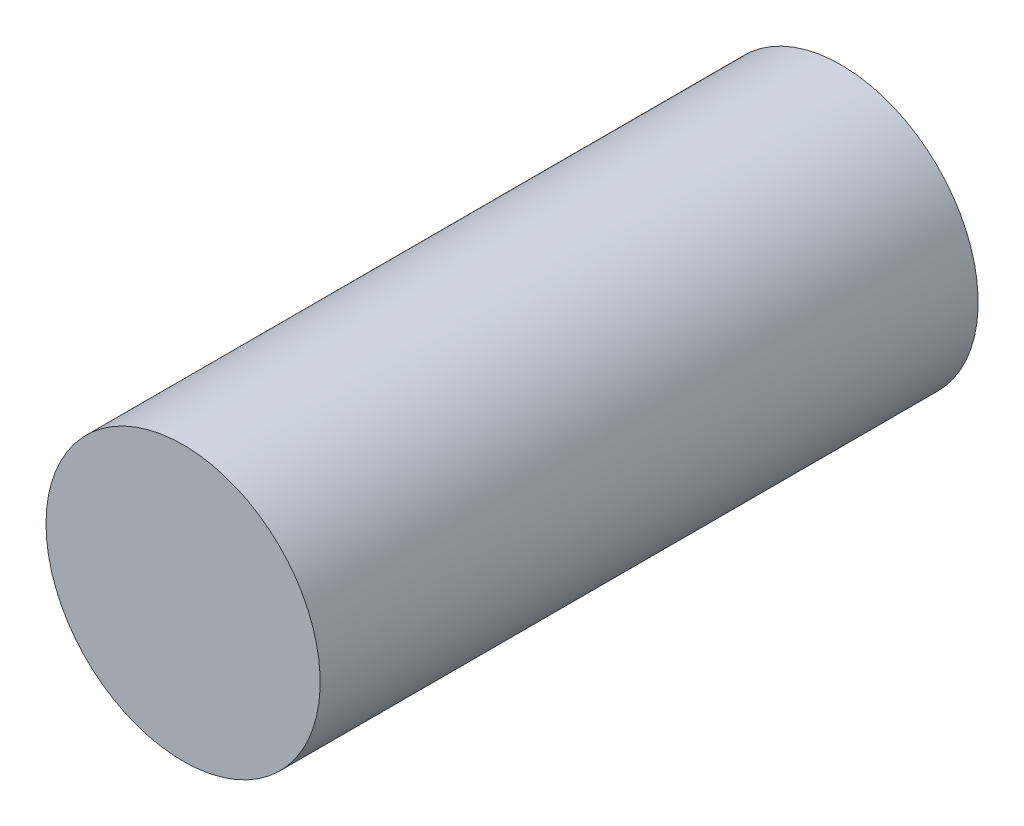
ISO-10303-21;
HEADER;
FILE_DESCRIPTION(('STEP AP214'),'2;1');
FILE_NAME('part.step','',(''),(''),'','','');
FILE_SCHEMA(('AUTOMOTIVE_DESIGN { 1 0 10303 214 1 1 1 1 }'));
ENDSEC;
DATA;
#1=APPLICATION_CONTEXT('core data for automotive mechanical design processes');
#2=APPLICATION_PROTOCOL_DEFINITION('international standard','automotive_design',2000,#1);
#3=PRODUCT_CONTEXT('',#1,'mechanical');
#4=PRODUCT('Part','Part','',(#3));
#5=PRODUCT_RELATED_PRODUCT_CATEGORY('part','',(#4));
#6=PRODUCT_DEFINITION_FORMATION('','',#4);
#7=PRODUCT_DEFINITION_CONTEXT('part definition',#1,'design');
#8=PRODUCT_DEFINITION('design','',#6,#7);
#9=PRODUCT_DEFINITION_SHAPE('','',#8);
#10=(LENGTH_UNIT() NAMED_UNIT(*) SI_UNIT(.MILLI.,.METRE.));
#11=(NAMED_UNIT(*) PLANE_ANGLE_UNIT() SI_UNIT($,.RADIAN.));
#12=(NAMED_UNIT(*) SI_UNIT($,.STERADIAN.) SOLID_ANGLE_UNIT());
#13=UNCERTAINTY_MEASURE_WITH_UNIT(LENGTH_MEASURE(1.E-05),#10,'distance_accuracy_value','');
#14=(GEOMETRIC_REPRESENTATION_CONTEXT(3) GLOBAL_UNCERTAINTY_ASSIGNED_CONTEXT((#13)) GLOBAL_UNIT_ASSIGNED_CONTEXT((#10,
#11,#12)) REPRESENTATION_CONTEXT('',''));
#15=CARTESIAN_POINT('',(0.,0.,0.));
#16=DIRECTION('',(0.,0.,1.));
#17=DIRECTION('',(1.,0.,0.));
#18=AXIS2_PLACEMENT_3D('',#15,#16,#17);
#19=CARTESIAN_POINT('',(0.,0.,304.8));
#20=DIRECTION('',(0.,0.,-1.));
#21=DIRECTION('',(-1.,0.,0.));
#22=AXIS2_PLACEMENT_3D('',#19,#20,#21);
#23=CYLINDRICAL_SURFACE('',#22,63.5);
#24=CARTESIAN_POINT('',(0.,0.,304.8));
#25=DIRECTION('',(0.,0.,1.));
#26=DIRECTION('',(1.,0.,0.));
#27=AXIS2_PLACEMENT_3D('',#24,#25,#26);
#28=CIRCLE('',#27,63.5);
#29=CARTESIAN_POINT('',(-63.5,0.,304.8));
#30=VERTEX_POINT('',#29);
#31=EDGE_CURVE('E10',#30,#30,#28,.T.);
#32=CARTESIAN_POINT('',(0.,0.,0.));
#33=DIRECTION('',(0.,0.,1.));
#34=DIRECTION('',(1.,0.,0.));
#35=AXIS2_PLACEMENT_3D('',#32,#33,#34);
#36=CIRCLE('',#35,63.5);
#37=CARTESIAN_POINT('',(-63.5,0.,0.));
#38=VERTEX_POINT('',#37);
#39=EDGE_CURVE('E34',#38,#38,#36,.T.);
#40=CARTESIAN_POINT('',(-63.5,0.,304.8));
#41=CARTESIAN_POINT('',(-63.5,0.,301.625));
#42=CARTESIAN_POINT('',(-63.5,0.,298.45));
#43=CARTESIAN_POINT('',(-63.5,0.,292.1));
#44=CARTESIAN_POINT('',(-63.5,0.,288.925));
#45=CARTESIAN_POINT('',(-63.5,0.,282.575));
#46=CARTESIAN_POINT('',(-63.5,0.,279.4));
#47=CARTESIAN_POINT('',(-63.5,0.,273.05));
#48=CARTESIAN_POINT('',(-63.5,0.,269.875));
#49=CARTESIAN_POINT('',(-63.5,0.,263.525));
#50=CARTESIAN_POINT('',(-63.5,0.,260.35));
#51=CARTESIAN_POINT('',(-63.5,0.,254.));
#52=CARTESIAN_POINT('',(-63.5,0.,250.825));
#53=CARTESIAN_POINT('',(-63.5,0.,244.475));
#54=CARTESIAN_POINT('',(-63.5,0.,241.3));
#55=CARTESIAN_POINT('',(-63.5,0.,234.95));
#56=CARTESIAN_POINT('',(-63.5,0.,231.775));
#57=CARTESIAN_POINT('',(-63.5,0.,225.425));
#58=CARTESIAN_POINT('',(-63.5,0.,222.25));
#59=CARTESIAN_POINT('',(-63.5,0.,215.9));
#60=CARTESIAN_POINT('',(-63.5,0.,212.725));
#61=CARTESIAN_POINT('',(-63.5,0.,206.375));
#62=CARTESIAN_POINT('',(-63.5,0.,203.2));
#63=CARTESIAN_POINT('',(-63.5,0.,196.85));
#64=CARTESIAN_POINT('',(-63.5,0.,193.675));
#65=CARTESIAN_POINT('',(-63.5,0.,187.325));
#66=CARTESIAN_POINT('',(-63.5,0.,184.15));
#67=CARTESIAN_POINT('',(-63.5,0.,177.8));
#68=CARTESIAN_POINT('',(-63.5,0.,174.625));
#69=CARTESIAN_POINT('',(-63.5,0.,168.275));
#70=CARTESIAN_POINT('',(-63.5,0.,165.1));
#71=CARTESIAN_POINT('',(-63.5,0.,158.75));
#72=CARTESIAN_POINT('',(-63.5,0.,155.575));
#73=CARTESIAN_POINT('',(-63.5,0.,149.225));
#74=CARTESIAN_POINT('',(-63.5,0.,146.05));
#75=CARTESIAN_POINT('',(-63.5,0.,139.7));
#76=CARTESIAN_POINT('',(-63.5,0.,136.525));
#77=CARTESIAN_POINT('',(-63.5,0.,130.175));
#78=CARTESIAN_POINT('',(-63.5,0.,127.));
#79=CARTESIAN_POINT('',(-63.5,0.,120.65));
#80=CARTESIAN_POINT('',(-63.5,0.,117.475));
#81=CARTESIAN_POINT('',(-63.5,0.,111.125));
#82=CARTESIAN_POINT('',(-63.5,0.,107.95));
#83=CARTESIAN_POINT('',(-63.5,0.,101.6));
#84=CARTESIAN_POINT('',(-63.5,0.,98.425));
#85=CARTESIAN_POINT('',(-63.5,0.,92.075));
#86=CARTESIAN_POINT('',(-63.5,0.,88.9));
#87=CARTESIAN_POINT('',(-63.5,0.,82.55));
#88=CARTESIAN_POINT('',(-63.5,0.,79.375));
#89=CARTESIAN_POINT('',(-63.5,0.,73.025));
#90=CARTESIAN_POINT('',(-63.5,0.,69.85));
#91=CARTESIAN_POINT('',(-63.5,0.,63.5));
#92=CARTESIAN_POINT('',(-63.5,0.,60.325));
#93=CARTESIAN_POINT('',(-63.5,0.,53.975));
#94=CARTESIAN_POINT('',(-63.5,0.,50.8));
#95=CARTESIAN_POINT('',(-63.5,0.,44.45));
#96=CARTESIAN_POINT('',(-63.5,0.,41.275));
#97=CARTESIAN_POINT('',(-63.5,0.,34.925));
#98=CARTESIAN_POINT('',(-63.5,0.,31.75));
#99=CARTESIAN_POINT('',(-63.5,0.,25.4));
#100=CARTESIAN_POINT('',(-63.5,0.,22.225));
#101=CARTESIAN_POINT('',(-63.5,0.,15.875));
#102=CARTESIAN_POINT('',(-63.5,0.,12.7));
#103=CARTESIAN_POINT('',(-63.5,0.,6.35));
#104=CARTESIAN_POINT('',(-63.5,0.,3.175));
#105=CARTESIAN_POINT('',(-63.5,0.,0.));
#106=B_SPLINE_CURVE_WITH_KNOTS('',3,(#40,#41,#42,#43,#44,#45,#46,#47,#48,#49,#50,#51,#52,#53,
#54,#55,#56,#57,#58,#59,#60,#61,#62,#63,#64,#65,#66,#67,#68,#69,#70,#71,#72,#73,#74,#75,#76,#77,
#78,#79,#80,#81,#82,#83,#84,#85,#86,#87,#88,#89,#90,#91,#92,#93,#94,#95,#96,#97,#98,#99,#100,
#101,#102,#103,#104,#105),.UNSPECIFIED.,.F.,.F.,(4,2,2,2,2,2,2,2,2,2,2,2,2,2,2,2,2,2,2,2,2,2,2,
2,2,2,2,2,2,2,2,2,4),(0.,9.52500000000001,19.05,28.575,38.1,47.625,57.15,66.675,76.2,
85.7250000000001,95.2500000000001,104.775,114.3,123.825,133.35,142.875,152.4,161.925,171.45,
180.975,190.5,200.025,209.55,219.075,228.6,238.125,247.65,257.175,266.7,276.225,285.75,295.275,
304.8),.UNSPECIFIED.);
#107=EDGE_CURVE('BSEAM31',#30,#38,#106,.T.);
#108=ORIENTED_EDGE('',*,*,#31,.F.);
#109=ORIENTED_EDGE('',*,*,#39,.T.);
#110=ORIENTED_EDGE('',*,*,#107,.T.);
#111=ORIENTED_EDGE('',*,*,#107,.F.);
#112=EDGE_LOOP('',(#108,#110,#109,#111));
#113=FACE_BOUND('',#112,.T.);
#114=ADVANCED_FACE('F31',(#113),#23,.T.);
#115=CARTESIAN_POINT('',(0.,0.,304.8));
#116=DIRECTION('',(0.,0.,1.));
#117=DIRECTION('',(1.,0.,0.));
#118=AXIS2_PLACEMENT_3D('',#115,#116,#117);
#119=PLANE('',#118);
#120=ORIENTED_EDGE('',*,*,#31,.T.);
#121=EDGE_LOOP('',(#120));
#122=FACE_BOUND('',#121,.T.);
#123=ADVANCED_FACE('F46',(#122),#119,.T.);
#124=CARTESIAN_POINT('',(0.,0.,0.));
#125=DIRECTION('',(0.,0.,1.));
#126=DIRECTION('',(1.,0.,0.));
#127=AXIS2_PLACEMENT_3D('',#124,#125,#126);
#128=PLANE('',#127);
#129=ORIENTED_EDGE('',*,*,#39,.F.);
#130=EDGE_LOOP('',(#129));
#131=FACE_BOUND('',#130,.T.);
#132=ADVANCED_FACE('F44',(#131),#128,.F.);
#133=CLOSED_SHELL('',(#114,#123,#132));
#134=MANIFOLD_SOLID_BREP('B2',#133);
#135=ADVANCED_BREP_SHAPE_REPRESENTATION('',(#18,#134),#14);
#136=SHAPE_DEFINITION_REPRESENTATION(#9,#135);
ENDSEC;
END-ISO-10303-21;
